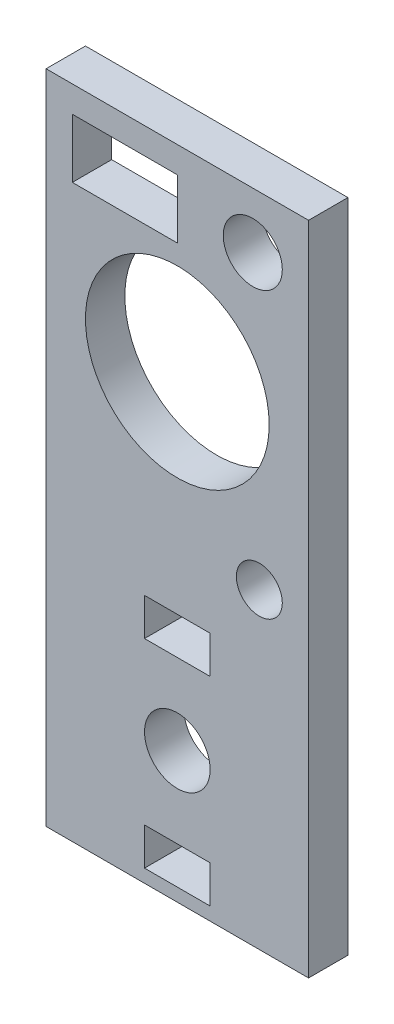
ISO-10303-21;
HEADER;
FILE_DESCRIPTION(('STEP AP214'),'2;1');
FILE_NAME('part.step','',(''),(''),'','','');
FILE_SCHEMA(('AUTOMOTIVE_DESIGN { 1 0 10303 214 1 1 1 1 }'));
ENDSEC;
DATA;
#1=APPLICATION_CONTEXT('core data for automotive mechanical design processes');
#2=APPLICATION_PROTOCOL_DEFINITION('international standard','automotive_design',2000,#1);
#3=PRODUCT_CONTEXT('',#1,'mechanical');
#4=PRODUCT('Part','Part','',(#3));
#5=PRODUCT_RELATED_PRODUCT_CATEGORY('part','',(#4));
#6=PRODUCT_DEFINITION_FORMATION('','',#4);
#7=PRODUCT_DEFINITION_CONTEXT('part definition',#1,'design');
#8=PRODUCT_DEFINITION('design','',#6,#7);
#9=PRODUCT_DEFINITION_SHAPE('','',#8);
#10=(LENGTH_UNIT() NAMED_UNIT(*) SI_UNIT(.MILLI.,.METRE.));
#11=(NAMED_UNIT(*) PLANE_ANGLE_UNIT() SI_UNIT($,.RADIAN.));
#12=(NAMED_UNIT(*) SI_UNIT($,.STERADIAN.) SOLID_ANGLE_UNIT());
#13=UNCERTAINTY_MEASURE_WITH_UNIT(LENGTH_MEASURE(1.E-05),#10,'distance_accuracy_value','');
#14=(GEOMETRIC_REPRESENTATION_CONTEXT(3) GLOBAL_UNCERTAINTY_ASSIGNED_CONTEXT((#13)) GLOBAL_UNIT_ASSIGNED_CONTEXT((#10,
#11,#12)) REPRESENTATION_CONTEXT('',''));
#15=CARTESIAN_POINT('',(0.,0.,0.));
#16=DIRECTION('',(0.,0.,1.));
#17=DIRECTION('',(1.,0.,0.));
#18=AXIS2_PLACEMENT_3D('',#15,#16,#17);
#19=CARTESIAN_POINT('',(0.,48.,3.));
#20=DIRECTION('',(0.,1.,0.));
#21=DIRECTION('',(0.,0.,1.));
#22=AXIS2_PLACEMENT_3D('',#19,#20,#21);
#23=PLANE('',#22);
#24=DIRECTION('',(1.,0.,0.));
#25=VECTOR('',#24,1.);
#26=CARTESIAN_POINT('',(0.,48.,0.));
#27=LINE('',#26,#25);
#28=CARTESIAN_POINT('',(2.,48.,0.));
#29=VERTEX_POINT('',#28);
#30=CARTESIAN_POINT('',(10.,48.,0.));
#31=VERTEX_POINT('',#30);
#32=EDGE_CURVE('E227',#29,#31,#27,.T.);
#33=ORIENTED_EDGE('',*,*,#32,.T.);
#34=DIRECTION('',(0.,0.,-1.));
#35=VECTOR('',#34,1.);
#36=CARTESIAN_POINT('',(10.,48.,3.));
#37=LINE('',#36,#35);
#38=CARTESIAN_POINT('',(10.,48.,3.));
#39=VERTEX_POINT('',#38);
#40=EDGE_CURVE('E11',#39,#31,#37,.T.);
#41=ORIENTED_EDGE('',*,*,#40,.F.);
#42=DIRECTION('',(1.,0.,0.));
#43=VECTOR('',#42,1.);
#44=CARTESIAN_POINT('',(0.,48.,3.));
#45=LINE('',#44,#43);
#46=CARTESIAN_POINT('',(2.,48.,3.));
#47=VERTEX_POINT('',#46);
#48=EDGE_CURVE('E162',#47,#39,#45,.T.);
#49=ORIENTED_EDGE('',*,*,#48,.F.);
#50=DIRECTION('',(0.,0.,-1.));
#51=VECTOR('',#50,1.);
#52=CARTESIAN_POINT('',(2.,48.,3.));
#53=LINE('',#52,#51);
#54=EDGE_CURVE('E54',#47,#29,#53,.T.);
#55=ORIENTED_EDGE('',*,*,#54,.T.);
#56=EDGE_LOOP('',(#33,#41,#49,#55));
#57=FACE_BOUND('',#56,.T.);
#58=ADVANCED_FACE('F35',(#57),#23,.F.);
#59=CARTESIAN_POINT('',(10.,0.,3.));
#60=DIRECTION('',(1.,0.,0.));
#61=DIRECTION('',(0.,0.,-1.));
#62=AXIS2_PLACEMENT_3D('',#59,#60,#61);
#63=PLANE('',#62);
#64=DIRECTION('',(0.,-1.,0.));
#65=VECTOR('',#64,1.);
#66=CARTESIAN_POINT('',(10.,0.,0.));
#67=LINE('',#66,#65);
#68=CARTESIAN_POINT('',(10.,43.5,0.));
#69=VERTEX_POINT('',#68);
#70=EDGE_CURVE('E168',#31,#69,#67,.T.);
#71=ORIENTED_EDGE('',*,*,#70,.T.);
#72=DIRECTION('',(0.,0.,-1.));
#73=VECTOR('',#72,1.);
#74=CARTESIAN_POINT('',(10.,43.5,3.));
#75=LINE('',#74,#73);
#76=CARTESIAN_POINT('',(10.,43.5,3.));
#77=VERTEX_POINT('',#76);
#78=EDGE_CURVE('E45',#77,#69,#75,.T.);
#79=ORIENTED_EDGE('',*,*,#78,.F.);
#80=DIRECTION('',(0.,-1.,0.));
#81=VECTOR('',#80,1.);
#82=CARTESIAN_POINT('',(10.,0.,3.));
#83=LINE('',#82,#81);
#84=EDGE_CURVE('E156',#39,#77,#83,.T.);
#85=ORIENTED_EDGE('',*,*,#84,.F.);
#86=ORIENTED_EDGE('',*,*,#40,.T.);
#87=EDGE_LOOP('',(#71,#79,#85,#86));
#88=FACE_BOUND('',#87,.T.);
#89=ADVANCED_FACE('F167',(#88),#63,.F.);
#90=CARTESIAN_POINT('',(0.,43.5,3.));
#91=DIRECTION('',(0.,1.,0.));
#92=DIRECTION('',(-1.,0.,0.));
#93=AXIS2_PLACEMENT_3D('',#90,#91,#92);
#94=PLANE('',#93);
#95=DIRECTION('',(1.,0.,0.));
#96=VECTOR('',#95,1.);
#97=CARTESIAN_POINT('',(0.,43.5,0.));
#98=LINE('',#97,#96);
#99=CARTESIAN_POINT('',(2.,43.5,0.));
#100=VERTEX_POINT('',#99);
#101=EDGE_CURVE('E230',#100,#69,#98,.T.);
#102=ORIENTED_EDGE('',*,*,#101,.F.);
#103=DIRECTION('',(0.,0.,-1.));
#104=VECTOR('',#103,1.);
#105=CARTESIAN_POINT('',(2.,43.5,3.));
#106=LINE('',#105,#104);
#107=CARTESIAN_POINT('',(2.,43.5,3.));
#108=VERTEX_POINT('',#107);
#109=EDGE_CURVE('E104',#108,#100,#106,.T.);
#110=ORIENTED_EDGE('',*,*,#109,.F.);
#111=DIRECTION('',(1.,0.,0.));
#112=VECTOR('',#111,1.);
#113=CARTESIAN_POINT('',(0.,43.5,3.));
#114=LINE('',#113,#112);
#115=EDGE_CURVE('E161',#108,#77,#114,.T.);
#116=ORIENTED_EDGE('',*,*,#115,.T.);
#117=ORIENTED_EDGE('',*,*,#78,.T.);
#118=EDGE_LOOP('',(#102,#110,#116,#117));
#119=FACE_BOUND('',#118,.T.);
#120=ADVANCED_FACE('F172',(#119),#94,.T.);
#121=CARTESIAN_POINT('',(20.,0.,3.));
#122=DIRECTION('',(1.,0.,0.));
#123=DIRECTION('',(0.,1.,0.));
#124=AXIS2_PLACEMENT_3D('',#121,#122,#123);
#125=PLANE('',#124);
#126=DIRECTION('',(0.,-1.,0.));
#127=VECTOR('',#126,1.);
#128=CARTESIAN_POINT('',(20.,0.,0.));
#129=LINE('',#128,#127);
#130=CARTESIAN_POINT('',(20.,50.,0.));
#131=VERTEX_POINT('',#130);
#132=CARTESIAN_POINT('',(20.,0.,0.));
#133=VERTEX_POINT('',#132);
#134=EDGE_CURVE('E215',#131,#133,#129,.T.);
#135=ORIENTED_EDGE('',*,*,#134,.F.);
#136=DIRECTION('',(0.,0.,-1.));
#137=VECTOR('',#136,1.);
#138=CARTESIAN_POINT('',(20.,50.,3.));
#139=LINE('',#138,#137);
#140=CARTESIAN_POINT('',(20.,50.,3.));
#141=VERTEX_POINT('',#140);
#142=EDGE_CURVE('E237',#141,#131,#139,.T.);
#143=ORIENTED_EDGE('',*,*,#142,.F.);
#144=DIRECTION('',(0.,-1.,0.));
#145=VECTOR('',#144,1.);
#146=CARTESIAN_POINT('',(20.,0.,3.));
#147=LINE('',#146,#145);
#148=CARTESIAN_POINT('',(20.,0.,3.));
#149=VERTEX_POINT('',#148);
#150=EDGE_CURVE('E300',#141,#149,#147,.T.);
#151=ORIENTED_EDGE('',*,*,#150,.T.);
#152=DIRECTION('',(0.,0.,-1.));
#153=VECTOR('',#152,1.);
#154=CARTESIAN_POINT('',(20.,0.,3.));
#155=LINE('',#154,#153);
#156=EDGE_CURVE('E239',#149,#133,#155,.T.);
#157=ORIENTED_EDGE('',*,*,#156,.T.);
#158=EDGE_LOOP('',(#135,#143,#151,#157));
#159=FACE_BOUND('',#158,.T.);
#160=ADVANCED_FACE('F320',(#159),#125,.T.);
#161=CARTESIAN_POINT('',(0.,50.,3.));
#162=DIRECTION('',(0.,1.,0.));
#163=DIRECTION('',(0.,0.,1.));
#164=AXIS2_PLACEMENT_3D('',#161,#162,#163);
#165=PLANE('',#164);
#166=DIRECTION('',(1.,0.,0.));
#167=VECTOR('',#166,1.);
#168=CARTESIAN_POINT('',(0.,50.,0.));
#169=LINE('',#168,#167);
#170=CARTESIAN_POINT('',(0.,50.,0.));
#171=VERTEX_POINT('',#170);
#172=EDGE_CURVE('E218',#171,#131,#169,.T.);
#173=ORIENTED_EDGE('',*,*,#172,.F.);
#174=DIRECTION('',(0.,0.,-1.));
#175=VECTOR('',#174,1.);
#176=CARTESIAN_POINT('',(0.,50.,3.));
#177=LINE('',#176,#175);
#178=CARTESIAN_POINT('',(0.,50.,3.));
#179=VERTEX_POINT('',#178);
#180=EDGE_CURVE('E245',#179,#171,#177,.T.);
#181=ORIENTED_EDGE('',*,*,#180,.F.);
#182=DIRECTION('',(1.,0.,0.));
#183=VECTOR('',#182,1.);
#184=CARTESIAN_POINT('',(0.,50.,3.));
#185=LINE('',#184,#183);
#186=EDGE_CURVE('E303',#179,#141,#185,.T.);
#187=ORIENTED_EDGE('',*,*,#186,.T.);
#188=ORIENTED_EDGE('',*,*,#142,.T.);
#189=EDGE_LOOP('',(#173,#181,#187,#188));
#190=FACE_BOUND('',#189,.T.);
#191=ADVANCED_FACE('F323',(#190),#165,.T.);
#192=CARTESIAN_POINT('',(0.,0.,3.));
#193=DIRECTION('',(1.,0.,0.));
#194=DIRECTION('',(0.,1.,0.));
#195=AXIS2_PLACEMENT_3D('',#192,#193,#194);
#196=PLANE('',#195);
#197=DIRECTION('',(0.,-1.,0.));
#198=VECTOR('',#197,1.);
#199=CARTESIAN_POINT('',(0.,0.,0.));
#200=LINE('',#199,#198);
#201=CARTESIAN_POINT('',(0.,0.,0.));
#202=VERTEX_POINT('',#201);
#203=EDGE_CURVE('E221',#171,#202,#200,.T.);
#204=ORIENTED_EDGE('',*,*,#203,.T.);
#205=DIRECTION('',(0.,0.,-1.));
#206=VECTOR('',#205,1.);
#207=CARTESIAN_POINT('',(0.,0.,3.));
#208=LINE('',#207,#206);
#209=CARTESIAN_POINT('',(0.,0.,3.));
#210=VERTEX_POINT('',#209);
#211=EDGE_CURVE('E241',#210,#202,#208,.T.);
#212=ORIENTED_EDGE('',*,*,#211,.F.);
#213=DIRECTION('',(0.,-1.,0.));
#214=VECTOR('',#213,1.);
#215=CARTESIAN_POINT('',(0.,0.,3.));
#216=LINE('',#215,#214);
#217=EDGE_CURVE('E306',#179,#210,#216,.T.);
#218=ORIENTED_EDGE('',*,*,#217,.F.);
#219=ORIENTED_EDGE('',*,*,#180,.T.);
#220=EDGE_LOOP('',(#204,#212,#218,#219));
#221=FACE_BOUND('',#220,.T.);
#222=ADVANCED_FACE('F326',(#221),#196,.F.);
#223=CARTESIAN_POINT('',(12.5,0.,3.));
#224=DIRECTION('',(-1.,0.,0.));
#225=DIRECTION('',(0.,0.,1.));
#226=AXIS2_PLACEMENT_3D('',#223,#224,#225);
#227=PLANE('',#226);
#228=DIRECTION('',(0.,1.,0.));
#229=VECTOR('',#228,1.);
#230=CARTESIAN_POINT('',(12.5,0.,0.));
#231=LINE('',#230,#229);
#232=CARTESIAN_POINT('',(12.5,1.,0.));
#233=VERTEX_POINT('',#232);
#234=CARTESIAN_POINT('',(12.5,3.85,0.));
#235=VERTEX_POINT('',#234);
#236=EDGE_CURVE('E203',#233,#235,#231,.T.);
#237=ORIENTED_EDGE('',*,*,#236,.F.);
#238=DIRECTION('',(0.,0.,-1.));
#239=VECTOR('',#238,1.);
#240=CARTESIAN_POINT('',(12.5,1.,3.));
#241=LINE('',#240,#239);
#242=CARTESIAN_POINT('',(12.5,1.,3.));
#243=VERTEX_POINT('',#242);
#244=EDGE_CURVE('E242',#243,#233,#241,.T.);
#245=ORIENTED_EDGE('',*,*,#244,.F.);
#246=DIRECTION('',(0.,1.,0.));
#247=VECTOR('',#246,1.);
#248=CARTESIAN_POINT('',(12.5,0.,3.));
#249=LINE('',#248,#247);
#250=CARTESIAN_POINT('',(12.5,3.85,3.));
#251=VERTEX_POINT('',#250);
#252=EDGE_CURVE('E282',#243,#251,#249,.T.);
#253=ORIENTED_EDGE('',*,*,#252,.T.);
#254=DIRECTION('',(0.,0.,-1.));
#255=VECTOR('',#254,1.);
#256=CARTESIAN_POINT('',(12.5,3.85,3.));
#257=LINE('',#256,#255);
#258=EDGE_CURVE('E248',#251,#235,#257,.T.);
#259=ORIENTED_EDGE('',*,*,#258,.T.);
#260=EDGE_LOOP('',(#237,#245,#253,#259));
#261=FACE_BOUND('',#260,.T.);
#262=ADVANCED_FACE('F356',(#261),#227,.T.);
#263=CARTESIAN_POINT('',(0.,1.,3.));
#264=DIRECTION('',(0.,1.,0.));
#265=DIRECTION('',(0.,0.,1.));
#266=AXIS2_PLACEMENT_3D('',#263,#264,#265);
#267=PLANE('',#266);
#268=DIRECTION('',(1.,0.,0.));
#269=VECTOR('',#268,1.);
#270=CARTESIAN_POINT('',(0.,1.,0.));
#271=LINE('',#270,#269);
#272=CARTESIAN_POINT('',(7.50000000000001,1.,0.));
#273=VERTEX_POINT('',#272);
#274=EDGE_CURVE('E206',#273,#233,#271,.T.);
#275=ORIENTED_EDGE('',*,*,#274,.F.);
#276=DIRECTION('',(0.,0.,-1.));
#277=VECTOR('',#276,1.);
#278=CARTESIAN_POINT('',(7.50000000000001,1.,3.));
#279=LINE('',#278,#277);
#280=CARTESIAN_POINT('',(7.50000000000001,1.,3.));
#281=VERTEX_POINT('',#280);
#282=EDGE_CURVE('E253',#281,#273,#279,.T.);
#283=ORIENTED_EDGE('',*,*,#282,.F.);
#284=DIRECTION('',(1.,0.,0.));
#285=VECTOR('',#284,1.);
#286=CARTESIAN_POINT('',(0.,1.,3.));
#287=LINE('',#286,#285);
#288=EDGE_CURVE('E292',#281,#243,#287,.T.);
#289=ORIENTED_EDGE('',*,*,#288,.T.);
#290=ORIENTED_EDGE('',*,*,#244,.T.);
#291=EDGE_LOOP('',(#275,#283,#289,#290));
#292=FACE_BOUND('',#291,.T.);
#293=ADVANCED_FACE('F367',(#292),#267,.T.);
#294=CARTESIAN_POINT('',(7.50000000000001,0.,3.));
#295=DIRECTION('',(-1.,0.,0.));
#296=DIRECTION('',(0.,0.,1.));
#297=AXIS2_PLACEMENT_3D('',#294,#295,#296);
#298=PLANE('',#297);
#299=DIRECTION('',(0.,1.,0.));
#300=VECTOR('',#299,1.);
#301=CARTESIAN_POINT('',(7.50000000000001,0.,0.));
#302=LINE('',#301,#300);
#303=CARTESIAN_POINT('',(7.50000000000001,3.85,0.));
#304=VERTEX_POINT('',#303);
#305=EDGE_CURVE('E209',#273,#304,#302,.T.);
#306=ORIENTED_EDGE('',*,*,#305,.T.);
#307=DIRECTION('',(0.,0.,-1.));
#308=VECTOR('',#307,1.);
#309=CARTESIAN_POINT('',(7.50000000000001,3.85,3.));
#310=LINE('',#309,#308);
#311=CARTESIAN_POINT('',(7.50000000000001,3.85,3.));
#312=VERTEX_POINT('',#311);
#313=EDGE_CURVE('E250',#312,#304,#310,.T.);
#314=ORIENTED_EDGE('',*,*,#313,.F.);
#315=DIRECTION('',(0.,1.,0.));
#316=VECTOR('',#315,1.);
#317=CARTESIAN_POINT('',(7.50000000000001,0.,3.));
#318=LINE('',#317,#316);
#319=EDGE_CURVE('E295',#281,#312,#318,.T.);
#320=ORIENTED_EDGE('',*,*,#319,.F.);
#321=ORIENTED_EDGE('',*,*,#282,.T.);
#322=EDGE_LOOP('',(#306,#314,#320,#321));
#323=FACE_BOUND('',#322,.T.);
#324=ADVANCED_FACE('F364',(#323),#298,.F.);
#325=CARTESIAN_POINT('',(0.,16.15,3.));
#326=DIRECTION('',(0.,1.,0.));
#327=DIRECTION('',(-1.,0.,0.));
#328=AXIS2_PLACEMENT_3D('',#325,#326,#327);
#329=PLANE('',#328);
#330=DIRECTION('',(1.,0.,0.));
#331=VECTOR('',#330,1.);
#332=CARTESIAN_POINT('',(0.,16.15,0.));
#333=LINE('',#332,#331);
#334=CARTESIAN_POINT('',(7.50000000000001,16.15,0.));
#335=VERTEX_POINT('',#334);
#336=CARTESIAN_POINT('',(12.5,16.15,0.));
#337=VERTEX_POINT('',#336);
#338=EDGE_CURVE('E191',#335,#337,#333,.T.);
#339=ORIENTED_EDGE('',*,*,#338,.F.);
#340=DIRECTION('',(0.,0.,-1.));
#341=VECTOR('',#340,1.);
#342=CARTESIAN_POINT('',(7.50000000000001,16.15,3.));
#343=LINE('',#342,#341);
#344=CARTESIAN_POINT('',(7.50000000000001,16.15,3.));
#345=VERTEX_POINT('',#344);
#346=EDGE_CURVE('E39',#345,#335,#343,.T.);
#347=ORIENTED_EDGE('',*,*,#346,.F.);
#348=DIRECTION('',(1.,0.,0.));
#349=VECTOR('',#348,1.);
#350=CARTESIAN_POINT('',(0.,16.15,3.));
#351=LINE('',#350,#349);
#352=CARTESIAN_POINT('',(12.5,16.15,3.));
#353=VERTEX_POINT('',#352);
#354=EDGE_CURVE('E286',#345,#353,#351,.T.);
#355=ORIENTED_EDGE('',*,*,#354,.T.);
#356=DIRECTION('',(0.,0.,-1.));
#357=VECTOR('',#356,1.);
#358=CARTESIAN_POINT('',(12.5,16.15,3.));
#359=LINE('',#358,#357);
#360=EDGE_CURVE('E175',#353,#337,#359,.T.);
#361=ORIENTED_EDGE('',*,*,#360,.T.);
#362=EDGE_LOOP('',(#339,#347,#355,#361));
#363=FACE_BOUND('',#362,.T.);
#364=ADVANCED_FACE('F269',(#363),#329,.T.);
#365=CARTESIAN_POINT('',(7.5,0.,3.));
#366=DIRECTION('',(1.,0.,0.));
#367=DIRECTION('',(0.,1.,0.));
#368=AXIS2_PLACEMENT_3D('',#365,#366,#367);
#369=PLANE('',#368);
#370=DIRECTION('',(0.,-1.,0.));
#371=VECTOR('',#370,1.);
#372=CARTESIAN_POINT('',(7.5,0.,0.));
#373=LINE('',#372,#371);
#374=CARTESIAN_POINT('',(7.50000000000001,19.,0.));
#375=VERTEX_POINT('',#374);
#376=EDGE_CURVE('E194',#375,#335,#373,.T.);
#377=ORIENTED_EDGE('',*,*,#376,.F.);
#378=DIRECTION('',(0.,0.,-1.));
#379=VECTOR('',#378,1.);
#380=CARTESIAN_POINT('',(7.50000000000001,19.,3.));
#381=LINE('',#380,#379);
#382=CARTESIAN_POINT('',(7.50000000000001,19.,3.));
#383=VERTEX_POINT('',#382);
#384=EDGE_CURVE('E259',#383,#375,#381,.T.);
#385=ORIENTED_EDGE('',*,*,#384,.F.);
#386=DIRECTION('',(0.,-1.,0.));
#387=VECTOR('',#386,1.);
#388=CARTESIAN_POINT('',(7.5,0.,3.));
#389=LINE('',#388,#387);
#390=EDGE_CURVE('E268',#383,#345,#389,.T.);
#391=ORIENTED_EDGE('',*,*,#390,.T.);
#392=ORIENTED_EDGE('',*,*,#346,.T.);
#393=EDGE_LOOP('',(#377,#385,#391,#392));
#394=FACE_BOUND('',#393,.T.);
#395=ADVANCED_FACE('F266',(#394),#369,.T.);
#396=CARTESIAN_POINT('',(0.,19.,3.));
#397=DIRECTION('',(0.,1.,0.));
#398=DIRECTION('',(0.,0.,1.));
#399=AXIS2_PLACEMENT_3D('',#396,#397,#398);
#400=PLANE('',#399);
#401=DIRECTION('',(1.,0.,0.));
#402=VECTOR('',#401,1.);
#403=CARTESIAN_POINT('',(0.,19.,0.));
#404=LINE('',#403,#402);
#405=CARTESIAN_POINT('',(12.5,19.,0.));
#406=VERTEX_POINT('',#405);
#407=EDGE_CURVE('E197',#375,#406,#404,.T.);
#408=ORIENTED_EDGE('',*,*,#407,.T.);
#409=DIRECTION('',(0.,0.,-1.));
#410=VECTOR('',#409,1.);
#411=CARTESIAN_POINT('',(12.5,19.,3.));
#412=LINE('',#411,#410);
#413=CARTESIAN_POINT('',(12.5,19.,3.));
#414=VERTEX_POINT('',#413);
#415=EDGE_CURVE('E257',#414,#406,#412,.T.);
#416=ORIENTED_EDGE('',*,*,#415,.F.);
#417=DIRECTION('',(1.,0.,0.));
#418=VECTOR('',#417,1.);
#419=CARTESIAN_POINT('',(0.,19.,3.));
#420=LINE('',#419,#418);
#421=EDGE_CURVE('E277',#383,#414,#420,.T.);
#422=ORIENTED_EDGE('',*,*,#421,.F.);
#423=ORIENTED_EDGE('',*,*,#384,.T.);
#424=EDGE_LOOP('',(#408,#416,#422,#423));
#425=FACE_BOUND('',#424,.T.);
#426=ADVANCED_FACE('F275',(#425),#400,.F.);
#427=CARTESIAN_POINT('',(0.,0.,3.));
#428=DIRECTION('',(0.,1.,0.));
#429=DIRECTION('',(-1.,0.,0.));
#430=AXIS2_PLACEMENT_3D('',#427,#428,#429);
#431=PLANE('',#430);
#432=DIRECTION('',(1.,0.,0.));
#433=VECTOR('',#432,1.);
#434=CARTESIAN_POINT('',(0.,0.,0.));
#435=LINE('',#434,#433);
#436=EDGE_CURVE('E224',#202,#133,#435,.T.);
#437=ORIENTED_EDGE('',*,*,#436,.T.);
#438=ORIENTED_EDGE('',*,*,#156,.F.);
#439=DIRECTION('',(1.,0.,0.));
#440=VECTOR('',#439,1.);
#441=CARTESIAN_POINT('',(0.,0.,3.));
#442=LINE('',#441,#440);
#443=EDGE_CURVE('E309',#210,#149,#442,.T.);
#444=ORIENTED_EDGE('',*,*,#443,.F.);
#445=ORIENTED_EDGE('',*,*,#211,.T.);
#446=EDGE_LOOP('',(#437,#438,#444,#445));
#447=FACE_BOUND('',#446,.T.);
#448=ADVANCED_FACE('F317',(#447),#431,.F.);
#449=CARTESIAN_POINT('',(0.,3.85,3.));
#450=DIRECTION('',(0.,1.,0.));
#451=DIRECTION('',(0.,0.,1.));
#452=AXIS2_PLACEMENT_3D('',#449,#450,#451);
#453=PLANE('',#452);
#454=DIRECTION('',(1.,0.,0.));
#455=VECTOR('',#454,1.);
#456=CARTESIAN_POINT('',(0.,3.85,0.));
#457=LINE('',#456,#455);
#458=EDGE_CURVE('E212',#304,#235,#457,.T.);
#459=ORIENTED_EDGE('',*,*,#458,.T.);
#460=ORIENTED_EDGE('',*,*,#258,.F.);
#461=DIRECTION('',(1.,0.,0.));
#462=VECTOR('',#461,1.);
#463=CARTESIAN_POINT('',(0.,3.85,3.));
#464=LINE('',#463,#462);
#465=EDGE_CURVE('E298',#312,#251,#464,.T.);
#466=ORIENTED_EDGE('',*,*,#465,.F.);
#467=ORIENTED_EDGE('',*,*,#313,.T.);
#468=EDGE_LOOP('',(#459,#460,#466,#467));
#469=FACE_BOUND('',#468,.T.);
#470=ADVANCED_FACE('F353',(#469),#453,.F.);
#471=CARTESIAN_POINT('',(12.5,0.,3.));
#472=DIRECTION('',(1.,0.,0.));
#473=DIRECTION('',(0.,1.,0.));
#474=AXIS2_PLACEMENT_3D('',#471,#472,#473);
#475=PLANE('',#474);
#476=DIRECTION('',(0.,-1.,0.));
#477=VECTOR('',#476,1.);
#478=CARTESIAN_POINT('',(12.5,0.,0.));
#479=LINE('',#478,#477);
#480=EDGE_CURVE('E200',#406,#337,#479,.T.);
#481=ORIENTED_EDGE('',*,*,#480,.T.);
#482=ORIENTED_EDGE('',*,*,#360,.F.);
#483=DIRECTION('',(0.,-1.,0.));
#484=VECTOR('',#483,1.);
#485=CARTESIAN_POINT('',(12.5,0.,3.));
#486=LINE('',#485,#484);
#487=EDGE_CURVE('E280',#414,#353,#486,.T.);
#488=ORIENTED_EDGE('',*,*,#487,.F.);
#489=ORIENTED_EDGE('',*,*,#415,.T.);
#490=EDGE_LOOP('',(#481,#482,#488,#489));
#491=FACE_BOUND('',#490,.T.);
#492=ADVANCED_FACE('F279',(#491),#475,.F.);
#493=CARTESIAN_POINT('',(16.25,23.75,3.));
#494=DIRECTION('',(0.,0.,-1.));
#495=DIRECTION('',(-1.,0.,0.));
#496=AXIS2_PLACEMENT_3D('',#493,#494,#495);
#497=CYLINDRICAL_SURFACE('',#496,1.75);
#498=CARTESIAN_POINT('',(16.25,23.75,3.));
#499=DIRECTION('',(0.,0.,1.));
#500=DIRECTION('',(1.,0.,0.));
#501=AXIS2_PLACEMENT_3D('',#498,#499,#500);
#502=CIRCLE('',#501,1.75);
#503=CARTESIAN_POINT('',(18.,23.75,3.));
#504=VERTEX_POINT('',#503);
#505=EDGE_CURVE('E410',#504,#504,#502,.T.);
#506=ORIENTED_EDGE('',*,*,#505,.T.);
#507=EDGE_LOOP('',(#506));
#508=FACE_BOUND('',#507,.T.);
#509=CARTESIAN_POINT('',(16.25,23.75,0.));
#510=DIRECTION('',(0.,0.,1.));
#511=DIRECTION('',(1.,0.,0.));
#512=AXIS2_PLACEMENT_3D('',#509,#510,#511);
#513=CIRCLE('',#512,1.75);
#514=CARTESIAN_POINT('',(18.,23.75,0.));
#515=VERTEX_POINT('',#514);
#516=EDGE_CURVE('E188',#515,#515,#513,.T.);
#517=ORIENTED_EDGE('',*,*,#516,.F.);
#518=EDGE_LOOP('',(#517));
#519=FACE_BOUND('',#518,.T.);
#520=ADVANCED_FACE('F377',(#508,#519),#497,.F.);
#521=CARTESIAN_POINT('',(15.75,45.75,3.));
#522=DIRECTION('',(0.,0.,-1.));
#523=DIRECTION('',(-1.,0.,0.));
#524=AXIS2_PLACEMENT_3D('',#521,#522,#523);
#525=CYLINDRICAL_SURFACE('',#524,2.25);
#526=CARTESIAN_POINT('',(15.75,45.75,3.));
#527=DIRECTION('',(0.,0.,1.));
#528=DIRECTION('',(1.,0.,0.));
#529=AXIS2_PLACEMENT_3D('',#526,#527,#528);
#530=CIRCLE('',#529,2.25);
#531=CARTESIAN_POINT('',(18.,45.75,3.));
#532=VERTEX_POINT('',#531);
#533=EDGE_CURVE('E407',#532,#532,#530,.T.);
#534=ORIENTED_EDGE('',*,*,#533,.T.);
#535=EDGE_LOOP('',(#534));
#536=FACE_BOUND('',#535,.T.);
#537=CARTESIAN_POINT('',(15.75,45.75,0.));
#538=DIRECTION('',(0.,0.,1.));
#539=DIRECTION('',(1.,0.,0.));
#540=AXIS2_PLACEMENT_3D('',#537,#538,#539);
#541=CIRCLE('',#540,2.25);
#542=CARTESIAN_POINT('',(18.,45.75,0.));
#543=VERTEX_POINT('',#542);
#544=EDGE_CURVE('E185',#543,#543,#541,.T.);
#545=ORIENTED_EDGE('',*,*,#544,.F.);
#546=EDGE_LOOP('',(#545));
#547=FACE_BOUND('',#546,.T.);
#548=ADVANCED_FACE('F386',(#536,#547),#525,.F.);
#549=CARTESIAN_POINT('',(9.99999999999999,10.,3.));
#550=DIRECTION('',(0.,0.,-1.));
#551=DIRECTION('',(-1.,0.,0.));
#552=AXIS2_PLACEMENT_3D('',#549,#550,#551);
#553=CYLINDRICAL_SURFACE('',#552,2.5);
#554=CARTESIAN_POINT('',(9.99999999999999,10.,3.));
#555=DIRECTION('',(0.,0.,1.));
#556=DIRECTION('',(1.,0.,0.));
#557=AXIS2_PLACEMENT_3D('',#554,#555,#556);
#558=CIRCLE('',#557,2.5);
#559=CARTESIAN_POINT('',(12.5,10.,3.));
#560=VERTEX_POINT('',#559);
#561=EDGE_CURVE('E397',#560,#560,#558,.T.);
#562=ORIENTED_EDGE('',*,*,#561,.T.);
#563=EDGE_LOOP('',(#562));
#564=FACE_BOUND('',#563,.T.);
#565=CARTESIAN_POINT('',(9.99999999999999,10.,0.));
#566=DIRECTION('',(0.,0.,1.));
#567=DIRECTION('',(1.,0.,0.));
#568=AXIS2_PLACEMENT_3D('',#565,#566,#567);
#569=CIRCLE('',#568,2.5);
#570=CARTESIAN_POINT('',(12.5,10.,0.));
#571=VERTEX_POINT('',#570);
#572=EDGE_CURVE('E182',#571,#571,#569,.T.);
#573=ORIENTED_EDGE('',*,*,#572,.F.);
#574=EDGE_LOOP('',(#573));
#575=FACE_BOUND('',#574,.T.);
#576=ADVANCED_FACE('F341',(#564,#575),#553,.F.);
#577=CARTESIAN_POINT('',(10.,35.,3.));
#578=DIRECTION('',(0.,0.,-1.));
#579=DIRECTION('',(-1.,0.,0.));
#580=AXIS2_PLACEMENT_3D('',#577,#578,#579);
#581=CYLINDRICAL_SURFACE('',#580,7.);
#582=CARTESIAN_POINT('',(10.,35.,3.));
#583=DIRECTION('',(0.,0.,1.));
#584=DIRECTION('',(1.,0.,0.));
#585=AXIS2_PLACEMENT_3D('',#582,#583,#584);
#586=CIRCLE('',#585,7.);
#587=CARTESIAN_POINT('',(17.,35.,3.));
#588=VERTEX_POINT('',#587);
#589=EDGE_CURVE('E235',#588,#588,#586,.T.);
#590=ORIENTED_EDGE('',*,*,#589,.T.);
#591=EDGE_LOOP('',(#590));
#592=FACE_BOUND('',#591,.T.);
#593=CARTESIAN_POINT('',(10.,35.,0.));
#594=DIRECTION('',(0.,0.,1.));
#595=DIRECTION('',(1.,0.,0.));
#596=AXIS2_PLACEMENT_3D('',#593,#594,#595);
#597=CIRCLE('',#596,7.);
#598=CARTESIAN_POINT('',(17.,35.,0.));
#599=VERTEX_POINT('',#598);
#600=EDGE_CURVE('E179',#599,#599,#597,.T.);
#601=ORIENTED_EDGE('',*,*,#600,.F.);
#602=EDGE_LOOP('',(#601));
#603=FACE_BOUND('',#602,.T.);
#604=ADVANCED_FACE('F37',(#592,#603),#581,.F.);
#605=CARTESIAN_POINT('',(1.99999999999995,0.,3.));
#606=DIRECTION('',(1.,0.,0.));
#607=DIRECTION('',(0.,1.,0.));
#608=AXIS2_PLACEMENT_3D('',#605,#606,#607);
#609=PLANE('',#608);
#610=DIRECTION('',(0.,-1.,0.));
#611=VECTOR('',#610,1.);
#612=CARTESIAN_POINT('',(1.99999999999995,0.,0.));
#613=LINE('',#612,#611);
#614=EDGE_CURVE('E232',#29,#100,#613,.T.);
#615=ORIENTED_EDGE('',*,*,#614,.F.);
#616=ORIENTED_EDGE('',*,*,#54,.F.);
#617=DIRECTION('',(0.,-1.,0.));
#618=VECTOR('',#617,1.);
#619=CARTESIAN_POINT('',(1.99999999999995,0.,3.));
#620=LINE('',#619,#618);
#621=EDGE_CURVE('E173',#47,#108,#620,.T.);
#622=ORIENTED_EDGE('',*,*,#621,.T.);
#623=ORIENTED_EDGE('',*,*,#109,.T.);
#624=EDGE_LOOP('',(#615,#616,#622,#623));
#625=FACE_BOUND('',#624,.T.);
#626=ADVANCED_FACE('F332',(#625),#609,.T.);
#627=CARTESIAN_POINT('',(0.,0.,3.));
#628=DIRECTION('',(0.,0.,1.));
#629=DIRECTION('',(1.,0.,0.));
#630=AXIS2_PLACEMENT_3D('',#627,#628,#629);
#631=PLANE('',#630);
#632=ORIENTED_EDGE('',*,*,#589,.F.);
#633=EDGE_LOOP('',(#632));
#634=FACE_BOUND('',#633,.T.);
#635=ORIENTED_EDGE('',*,*,#561,.F.);
#636=EDGE_LOOP('',(#635));
#637=FACE_BOUND('',#636,.T.);
#638=ORIENTED_EDGE('',*,*,#533,.F.);
#639=EDGE_LOOP('',(#638));
#640=FACE_BOUND('',#639,.T.);
#641=ORIENTED_EDGE('',*,*,#505,.F.);
#642=EDGE_LOOP('',(#641));
#643=FACE_BOUND('',#642,.T.);
#644=ORIENTED_EDGE('',*,*,#354,.F.);
#645=ORIENTED_EDGE('',*,*,#390,.F.);
#646=ORIENTED_EDGE('',*,*,#421,.T.);
#647=ORIENTED_EDGE('',*,*,#487,.T.);
#648=EDGE_LOOP('',(#644,#645,#646,#647));
#649=FACE_BOUND('',#648,.T.);
#650=ORIENTED_EDGE('',*,*,#252,.F.);
#651=ORIENTED_EDGE('',*,*,#288,.F.);
#652=ORIENTED_EDGE('',*,*,#319,.T.);
#653=ORIENTED_EDGE('',*,*,#465,.T.);
#654=EDGE_LOOP('',(#650,#651,#652,#653));
#655=FACE_BOUND('',#654,.T.);
#656=ORIENTED_EDGE('',*,*,#150,.F.);
#657=ORIENTED_EDGE('',*,*,#186,.F.);
#658=ORIENTED_EDGE('',*,*,#217,.T.);
#659=ORIENTED_EDGE('',*,*,#443,.T.);
#660=EDGE_LOOP('',(#656,#657,#658,#659));
#661=FACE_BOUND('',#660,.T.);
#662=ORIENTED_EDGE('',*,*,#48,.T.);
#663=ORIENTED_EDGE('',*,*,#84,.T.);
#664=ORIENTED_EDGE('',*,*,#115,.F.);
#665=ORIENTED_EDGE('',*,*,#621,.F.);
#666=EDGE_LOOP('',(#662,#663,#664,#665));
#667=FACE_BOUND('',#666,.T.);
#668=ADVANCED_FACE('F158',(#634,#637,#640,#643,#649,#655,#661,#667),#631,.T.);
#669=CARTESIAN_POINT('',(0.,0.,0.));
#670=DIRECTION('',(0.,0.,1.));
#671=DIRECTION('',(1.,0.,0.));
#672=AXIS2_PLACEMENT_3D('',#669,#670,#671);
#673=PLANE('',#672);
#674=ORIENTED_EDGE('',*,*,#600,.T.);
#675=EDGE_LOOP('',(#674));
#676=FACE_BOUND('',#675,.T.);
#677=ORIENTED_EDGE('',*,*,#572,.T.);
#678=EDGE_LOOP('',(#677));
#679=FACE_BOUND('',#678,.T.);
#680=ORIENTED_EDGE('',*,*,#544,.T.);
#681=EDGE_LOOP('',(#680));
#682=FACE_BOUND('',#681,.T.);
#683=ORIENTED_EDGE('',*,*,#516,.T.);
#684=EDGE_LOOP('',(#683));
#685=FACE_BOUND('',#684,.T.);
#686=ORIENTED_EDGE('',*,*,#338,.T.);
#687=ORIENTED_EDGE('',*,*,#480,.F.);
#688=ORIENTED_EDGE('',*,*,#407,.F.);
#689=ORIENTED_EDGE('',*,*,#376,.T.);
#690=EDGE_LOOP('',(#686,#687,#688,#689));
#691=FACE_BOUND('',#690,.T.);
#692=ORIENTED_EDGE('',*,*,#236,.T.);
#693=ORIENTED_EDGE('',*,*,#458,.F.);
#694=ORIENTED_EDGE('',*,*,#305,.F.);
#695=ORIENTED_EDGE('',*,*,#274,.T.);
#696=EDGE_LOOP('',(#692,#693,#694,#695));
#697=FACE_BOUND('',#696,.T.);
#698=ORIENTED_EDGE('',*,*,#134,.T.);
#699=ORIENTED_EDGE('',*,*,#436,.F.);
#700=ORIENTED_EDGE('',*,*,#203,.F.);
#701=ORIENTED_EDGE('',*,*,#172,.T.);
#702=EDGE_LOOP('',(#698,#699,#700,#701));
#703=FACE_BOUND('',#702,.T.);
#704=ORIENTED_EDGE('',*,*,#32,.F.);
#705=ORIENTED_EDGE('',*,*,#614,.T.);
#706=ORIENTED_EDGE('',*,*,#101,.T.);
#707=ORIENTED_EDGE('',*,*,#70,.F.);
#708=EDGE_LOOP('',(#704,#705,#706,#707));
#709=FACE_BOUND('',#708,.T.);
#710=ADVANCED_FACE('F272',(#676,#679,#682,#685,#691,#697,#703,#709),#673,.F.);
#711=CLOSED_SHELL('',(#58,#89,#120,#160,#191,#222,#262,#293,#324,#364,#395,#426,#448,#470,#492,
#520,#548,#576,#604,#626,#668,#710));
#712=MANIFOLD_SOLID_BREP('B2',#711);
#713=ADVANCED_BREP_SHAPE_REPRESENTATION('',(#18,#712),#14);
#714=SHAPE_DEFINITION_REPRESENTATION(#9,#713);
ENDSEC;
END-ISO-10303-21;
